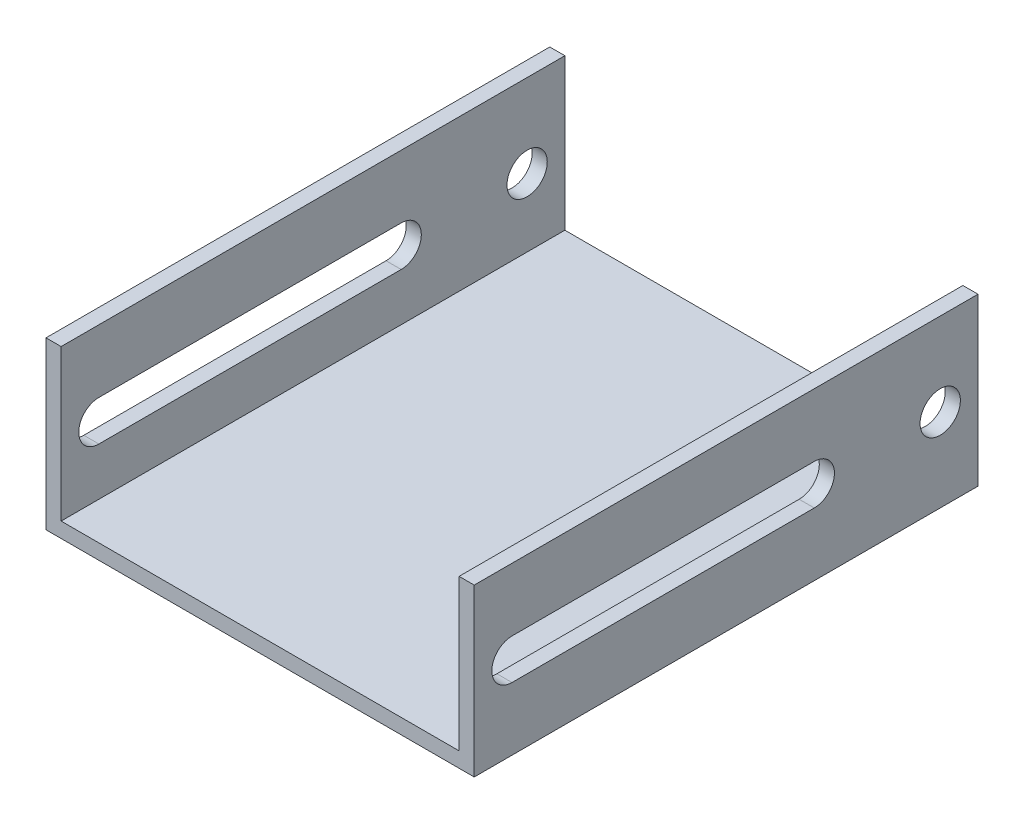
ISO-10303-21;
HEADER;
FILE_DESCRIPTION(('STEP AP214'),'2;1');
FILE_NAME('part.step','',(''),(''),'','','');
FILE_SCHEMA(('AUTOMOTIVE_DESIGN { 1 0 10303 214 1 1 1 1 }'));
ENDSEC;
DATA;
#1=APPLICATION_CONTEXT('core data for automotive mechanical design processes');
#2=APPLICATION_PROTOCOL_DEFINITION('international standard','automotive_design',2000,#1);
#3=PRODUCT_CONTEXT('',#1,'mechanical');
#4=PRODUCT('Part','Part','',(#3));
#5=PRODUCT_RELATED_PRODUCT_CATEGORY('part','',(#4));
#6=PRODUCT_DEFINITION_FORMATION('','',#4);
#7=PRODUCT_DEFINITION_CONTEXT('part definition',#1,'design');
#8=PRODUCT_DEFINITION('design','',#6,#7);
#9=PRODUCT_DEFINITION_SHAPE('','',#8);
#10=(LENGTH_UNIT() NAMED_UNIT(*) SI_UNIT(.MILLI.,.METRE.));
#11=(NAMED_UNIT(*) PLANE_ANGLE_UNIT() SI_UNIT($,.RADIAN.));
#12=(NAMED_UNIT(*) SI_UNIT($,.STERADIAN.) SOLID_ANGLE_UNIT());
#13=UNCERTAINTY_MEASURE_WITH_UNIT(LENGTH_MEASURE(1.E-05),#10,'distance_accuracy_value','');
#14=(GEOMETRIC_REPRESENTATION_CONTEXT(3) GLOBAL_UNCERTAINTY_ASSIGNED_CONTEXT((#13)) GLOBAL_UNIT_ASSIGNED_CONTEXT((#10,
#11,#12)) REPRESENTATION_CONTEXT('',''));
#15=CARTESIAN_POINT('',(0.,0.,0.));
#16=DIRECTION('',(0.,0.,1.));
#17=DIRECTION('',(1.,0.,0.));
#18=AXIS2_PLACEMENT_3D('',#15,#16,#17);
#19=CARTESIAN_POINT('',(0.,3.,0.));
#20=DIRECTION('',(0.,-1.,0.));
#21=DIRECTION('',(0.,0.,-1.));
#22=AXIS2_PLACEMENT_3D('',#19,#20,#21);
#23=PLANE('',#22);
#24=DIRECTION('',(0.,0.,1.));
#25=VECTOR('',#24,1.);
#26=CARTESIAN_POINT('',(39.5,3.,50.));
#27=LINE('',#26,#25);
#28=CARTESIAN_POINT('',(39.5,3.,-50.));
#29=VERTEX_POINT('',#28);
#30=CARTESIAN_POINT('',(39.5,3.,50.));
#31=VERTEX_POINT('',#30);
#32=EDGE_CURVE('E210',#29,#31,#27,.T.);
#33=ORIENTED_EDGE('',*,*,#32,.F.);
#34=DIRECTION('',(-1.,0.,0.));
#35=VECTOR('',#34,1.);
#36=CARTESIAN_POINT('',(-42.5,3.,-50.));
#37=LINE('',#36,#35);
#38=CARTESIAN_POINT('',(-39.5,3.,-50.));
#39=VERTEX_POINT('',#38);
#40=EDGE_CURVE('E261',#29,#39,#37,.T.);
#41=ORIENTED_EDGE('',*,*,#40,.T.);
#42=DIRECTION('',(0.,0.,-1.));
#43=VECTOR('',#42,1.);
#44=CARTESIAN_POINT('',(-39.5,3.,-50.));
#45=LINE('',#44,#43);
#46=CARTESIAN_POINT('',(-39.5,3.,50.));
#47=VERTEX_POINT('',#46);
#48=EDGE_CURVE('E229',#47,#39,#45,.T.);
#49=ORIENTED_EDGE('',*,*,#48,.F.);
#50=DIRECTION('',(1.,0.,0.));
#51=VECTOR('',#50,1.);
#52=CARTESIAN_POINT('',(-42.5,3.,50.));
#53=LINE('',#52,#51);
#54=EDGE_CURVE('E249',#47,#31,#53,.T.);
#55=ORIENTED_EDGE('',*,*,#54,.T.);
#56=EDGE_LOOP('',(#33,#41,#49,#55));
#57=FACE_BOUND('',#56,.T.);
#58=ADVANCED_FACE('F35',(#57),#23,.F.);
#59=CARTESIAN_POINT('',(42.5,3.,50.));
#60=DIRECTION('',(-1.,0.,0.));
#61=DIRECTION('',(0.,0.,1.));
#62=AXIS2_PLACEMENT_3D('',#59,#60,#61);
#63=PLANE('',#62);
#64=DIRECTION('',(0.,0.,1.));
#65=VECTOR('',#64,1.);
#66=CARTESIAN_POINT('',(42.5,20.5,42.5));
#67=LINE('',#66,#65);
#68=CARTESIAN_POINT('',(42.5,20.5,-17.5));
#69=VERTEX_POINT('',#68);
#70=CARTESIAN_POINT('',(42.5,20.5,42.5));
#71=VERTEX_POINT('',#70);
#72=EDGE_CURVE('E163',#69,#71,#67,.T.);
#73=ORIENTED_EDGE('',*,*,#72,.F.);
#74=CARTESIAN_POINT('',(42.5,16.5,-17.5));
#75=DIRECTION('',(1.,0.,0.));
#76=DIRECTION('',(0.,0.,-1.));
#77=AXIS2_PLACEMENT_3D('',#74,#75,#76);
#78=CIRCLE('',#77,4.);
#79=CARTESIAN_POINT('',(42.5,12.5,-17.5));
#80=VERTEX_POINT('',#79);
#81=EDGE_CURVE('E50',#80,#69,#78,.T.);
#82=ORIENTED_EDGE('',*,*,#81,.F.);
#83=DIRECTION('',(0.,0.,-1.));
#84=VECTOR('',#83,1.);
#85=CARTESIAN_POINT('',(42.5,12.5,42.5));
#86=LINE('',#85,#84);
#87=CARTESIAN_POINT('',(42.5,12.5,42.5));
#88=VERTEX_POINT('',#87);
#89=EDGE_CURVE('E170',#88,#80,#86,.T.);
#90=ORIENTED_EDGE('',*,*,#89,.F.);
#91=CARTESIAN_POINT('',(42.5,16.5,42.5));
#92=DIRECTION('',(1.,0.,0.));
#93=DIRECTION('',(0.,0.,-1.));
#94=AXIS2_PLACEMENT_3D('',#91,#92,#93);
#95=CIRCLE('',#94,4.00000000000001);
#96=EDGE_CURVE('E154',#71,#88,#95,.T.);
#97=ORIENTED_EDGE('',*,*,#96,.F.);
#98=EDGE_LOOP('',(#73,#82,#90,#97));
#99=FACE_BOUND('',#98,.T.);
#100=CARTESIAN_POINT('',(42.5,16.5,-42.5));
#101=DIRECTION('',(1.,0.,0.));
#102=DIRECTION('',(0.,0.,-1.));
#103=AXIS2_PLACEMENT_3D('',#100,#101,#102);
#104=CIRCLE('',#103,4.00000000000001);
#105=CARTESIAN_POINT('',(42.5,16.5,-46.5));
#106=VERTEX_POINT('',#105);
#107=EDGE_CURVE('E200',#106,#106,#104,.T.);
#108=ORIENTED_EDGE('',*,*,#107,.F.);
#109=EDGE_LOOP('',(#108));
#110=FACE_BOUND('',#109,.T.);
#111=DIRECTION('',(0.,0.,-1.));
#112=VECTOR('',#111,1.);
#113=CARTESIAN_POINT('',(42.5,0.,50.));
#114=LINE('',#113,#112);
#115=CARTESIAN_POINT('',(42.5,0.,50.));
#116=VERTEX_POINT('',#115);
#117=CARTESIAN_POINT('',(42.5,0.,-50.));
#118=VERTEX_POINT('',#117);
#119=EDGE_CURVE('E258',#116,#118,#114,.T.);
#120=ORIENTED_EDGE('',*,*,#119,.T.);
#121=DIRECTION('',(0.,-1.,0.));
#122=VECTOR('',#121,1.);
#123=CARTESIAN_POINT('',(42.5,3.,-50.));
#124=LINE('',#123,#122);
#125=CARTESIAN_POINT('',(42.5,33.,-50.));
#126=VERTEX_POINT('',#125);
#127=EDGE_CURVE('E268',#126,#118,#124,.T.);
#128=ORIENTED_EDGE('',*,*,#127,.F.);
#129=DIRECTION('',(0.,0.,-1.));
#130=VECTOR('',#129,1.);
#131=CARTESIAN_POINT('',(42.5,33.,50.));
#132=LINE('',#131,#130);
#133=CARTESIAN_POINT('',(42.5,33.,50.));
#134=VERTEX_POINT('',#133);
#135=EDGE_CURVE('E211',#134,#126,#132,.T.);
#136=ORIENTED_EDGE('',*,*,#135,.F.);
#137=DIRECTION('',(0.,-1.,0.));
#138=VECTOR('',#137,1.);
#139=CARTESIAN_POINT('',(42.5,3.,50.));
#140=LINE('',#139,#138);
#141=EDGE_CURVE('E336',#134,#116,#140,.T.);
#142=ORIENTED_EDGE('',*,*,#141,.T.);
#143=EDGE_LOOP('',(#120,#128,#136,#142));
#144=FACE_BOUND('',#143,.T.);
#145=ADVANCED_FACE('F37',(#99,#110,#144),#63,.F.);
#146=CARTESIAN_POINT('',(-42.5,3.,-50.));
#147=DIRECTION('',(0.,0.,1.));
#148=DIRECTION('',(1.,0.,0.));
#149=AXIS2_PLACEMENT_3D('',#146,#147,#148);
#150=PLANE('',#149);
#151=DIRECTION('',(-1.,0.,0.));
#152=VECTOR('',#151,1.);
#153=CARTESIAN_POINT('',(-42.5,0.,-50.));
#154=LINE('',#153,#152);
#155=CARTESIAN_POINT('',(-42.5,0.,-50.));
#156=VERTEX_POINT('',#155);
#157=EDGE_CURVE('E316',#118,#156,#154,.T.);
#158=ORIENTED_EDGE('',*,*,#157,.T.);
#159=DIRECTION('',(0.,-1.,0.));
#160=VECTOR('',#159,1.);
#161=CARTESIAN_POINT('',(-42.5,3.,-50.));
#162=LINE('',#161,#160);
#163=CARTESIAN_POINT('',(-42.5,33.,-50.));
#164=VERTEX_POINT('',#163);
#165=EDGE_CURVE('E319',#164,#156,#162,.T.);
#166=ORIENTED_EDGE('',*,*,#165,.F.);
#167=DIRECTION('',(-1.,0.,0.));
#168=VECTOR('',#167,1.);
#169=CARTESIAN_POINT('',(-42.5,33.,-50.));
#170=LINE('',#169,#168);
#171=CARTESIAN_POINT('',(-39.5,33.,-50.));
#172=VERTEX_POINT('',#171);
#173=EDGE_CURVE('E237',#172,#164,#170,.T.);
#174=ORIENTED_EDGE('',*,*,#173,.F.);
#175=DIRECTION('',(0.,-1.,0.));
#176=VECTOR('',#175,1.);
#177=CARTESIAN_POINT('',(-39.5,33.,-50.));
#178=LINE('',#177,#176);
#179=EDGE_CURVE('E240',#172,#39,#178,.T.);
#180=ORIENTED_EDGE('',*,*,#179,.T.);
#181=ORIENTED_EDGE('',*,*,#40,.F.);
#182=DIRECTION('',(0.,-1.,0.));
#183=VECTOR('',#182,1.);
#184=CARTESIAN_POINT('',(39.5,33.,-50.));
#185=LINE('',#184,#183);
#186=CARTESIAN_POINT('',(39.5,33.,-50.));
#187=VERTEX_POINT('',#186);
#188=EDGE_CURVE('E226',#187,#29,#185,.T.);
#189=ORIENTED_EDGE('',*,*,#188,.F.);
#190=DIRECTION('',(-1.,0.,0.));
#191=VECTOR('',#190,1.);
#192=CARTESIAN_POINT('',(42.5,33.,-50.));
#193=LINE('',#192,#191);
#194=EDGE_CURVE('E214',#126,#187,#193,.T.);
#195=ORIENTED_EDGE('',*,*,#194,.F.);
#196=ORIENTED_EDGE('',*,*,#127,.T.);
#197=EDGE_LOOP('',(#158,#166,#174,#180,#181,#189,#195,#196));
#198=FACE_BOUND('',#197,.T.);
#199=ADVANCED_FACE('F295',(#198),#150,.F.);
#200=CARTESIAN_POINT('',(-42.5,3.,50.));
#201=DIRECTION('',(1.,0.,0.));
#202=DIRECTION('',(0.,0.,-1.));
#203=AXIS2_PLACEMENT_3D('',#200,#201,#202);
#204=PLANE('',#203);
#205=DIRECTION('',(0.,0.,1.));
#206=VECTOR('',#205,1.);
#207=CARTESIAN_POINT('',(-42.5,12.5,42.5));
#208=LINE('',#207,#206);
#209=CARTESIAN_POINT('',(-42.5,12.5,-17.5));
#210=VERTEX_POINT('',#209);
#211=CARTESIAN_POINT('',(-42.5,12.5,42.5));
#212=VERTEX_POINT('',#211);
#213=EDGE_CURVE('E405',#210,#212,#208,.T.);
#214=ORIENTED_EDGE('',*,*,#213,.F.);
#215=CARTESIAN_POINT('',(-42.5,16.5,-17.5));
#216=DIRECTION('',(1.,0.,0.));
#217=DIRECTION('',(0.,0.,-1.));
#218=AXIS2_PLACEMENT_3D('',#215,#216,#217);
#219=CIRCLE('',#218,4.);
#220=CARTESIAN_POINT('',(-42.5,20.5,-17.5));
#221=VERTEX_POINT('',#220);
#222=EDGE_CURVE('E188',#221,#210,#219,.F.);
#223=ORIENTED_EDGE('',*,*,#222,.F.);
#224=DIRECTION('',(0.,0.,-1.));
#225=VECTOR('',#224,1.);
#226=CARTESIAN_POINT('',(-42.5,20.5,42.5));
#227=LINE('',#226,#225);
#228=CARTESIAN_POINT('',(-42.5,20.5,42.5));
#229=VERTEX_POINT('',#228);
#230=EDGE_CURVE('E185',#229,#221,#227,.T.);
#231=ORIENTED_EDGE('',*,*,#230,.F.);
#232=CARTESIAN_POINT('',(-42.5,16.5,42.5));
#233=DIRECTION('',(1.,0.,0.));
#234=DIRECTION('',(0.,0.,-1.));
#235=AXIS2_PLACEMENT_3D('',#232,#233,#234);
#236=CIRCLE('',#235,4.00000000000001);
#237=EDGE_CURVE('E178',#212,#229,#236,.F.);
#238=ORIENTED_EDGE('',*,*,#237,.F.);
#239=EDGE_LOOP('',(#214,#223,#231,#238));
#240=FACE_BOUND('',#239,.T.);
#241=CARTESIAN_POINT('',(-42.5,16.5,-42.5));
#242=DIRECTION('',(1.,0.,0.));
#243=DIRECTION('',(0.,0.,-1.));
#244=AXIS2_PLACEMENT_3D('',#241,#242,#243);
#245=CIRCLE('',#244,4.00000000000001);
#246=CARTESIAN_POINT('',(-42.5,16.5,-46.5));
#247=VERTEX_POINT('',#246);
#248=EDGE_CURVE('E203',#247,#247,#245,.F.);
#249=ORIENTED_EDGE('',*,*,#248,.F.);
#250=EDGE_LOOP('',(#249));
#251=FACE_BOUND('',#250,.T.);
#252=DIRECTION('',(0.,0.,1.));
#253=VECTOR('',#252,1.);
#254=CARTESIAN_POINT('',(-42.5,0.,50.));
#255=LINE('',#254,#253);
#256=CARTESIAN_POINT('',(-42.5,0.,50.));
#257=VERTEX_POINT('',#256);
#258=EDGE_CURVE('E324',#156,#257,#255,.T.);
#259=ORIENTED_EDGE('',*,*,#258,.T.);
#260=DIRECTION('',(0.,-1.,0.));
#261=VECTOR('',#260,1.);
#262=CARTESIAN_POINT('',(-42.5,3.,50.));
#263=LINE('',#262,#261);
#264=CARTESIAN_POINT('',(-42.5,33.,50.));
#265=VERTEX_POINT('',#264);
#266=EDGE_CURVE('E329',#265,#257,#263,.T.);
#267=ORIENTED_EDGE('',*,*,#266,.F.);
#268=DIRECTION('',(0.,0.,1.));
#269=VECTOR('',#268,1.);
#270=CARTESIAN_POINT('',(-42.5,33.,-50.));
#271=LINE('',#270,#269);
#272=EDGE_CURVE('E230',#164,#265,#271,.T.);
#273=ORIENTED_EDGE('',*,*,#272,.F.);
#274=ORIENTED_EDGE('',*,*,#165,.T.);
#275=EDGE_LOOP('',(#259,#267,#273,#274));
#276=FACE_BOUND('',#275,.T.);
#277=ADVANCED_FACE('F307',(#240,#251,#276),#204,.F.);
#278=CARTESIAN_POINT('',(-42.5,3.,50.));
#279=DIRECTION('',(0.,0.,-1.));
#280=DIRECTION('',(-1.,0.,0.));
#281=AXIS2_PLACEMENT_3D('',#278,#279,#280);
#282=PLANE('',#281);
#283=DIRECTION('',(1.,0.,0.));
#284=VECTOR('',#283,1.);
#285=CARTESIAN_POINT('',(-42.5,0.,50.));
#286=LINE('',#285,#284);
#287=EDGE_CURVE('E263',#257,#116,#286,.T.);
#288=ORIENTED_EDGE('',*,*,#287,.T.);
#289=ORIENTED_EDGE('',*,*,#141,.F.);
#290=DIRECTION('',(1.,0.,0.));
#291=VECTOR('',#290,1.);
#292=CARTESIAN_POINT('',(42.5,33.,50.));
#293=LINE('',#292,#291);
#294=CARTESIAN_POINT('',(39.5,33.,50.));
#295=VERTEX_POINT('',#294);
#296=EDGE_CURVE('E218',#295,#134,#293,.T.);
#297=ORIENTED_EDGE('',*,*,#296,.F.);
#298=DIRECTION('',(0.,-1.,0.));
#299=VECTOR('',#298,1.);
#300=CARTESIAN_POINT('',(39.5,33.,50.));
#301=LINE('',#300,#299);
#302=EDGE_CURVE('E221',#295,#31,#301,.T.);
#303=ORIENTED_EDGE('',*,*,#302,.T.);
#304=ORIENTED_EDGE('',*,*,#54,.F.);
#305=DIRECTION('',(0.,-1.,0.));
#306=VECTOR('',#305,1.);
#307=CARTESIAN_POINT('',(-39.5,33.,50.));
#308=LINE('',#307,#306);
#309=CARTESIAN_POINT('',(-39.5,33.,50.));
#310=VERTEX_POINT('',#309);
#311=EDGE_CURVE('E253',#310,#47,#308,.T.);
#312=ORIENTED_EDGE('',*,*,#311,.F.);
#313=DIRECTION('',(1.,0.,0.));
#314=VECTOR('',#313,1.);
#315=CARTESIAN_POINT('',(-42.5,33.,50.));
#316=LINE('',#315,#314);
#317=EDGE_CURVE('E233',#265,#310,#316,.T.);
#318=ORIENTED_EDGE('',*,*,#317,.F.);
#319=ORIENTED_EDGE('',*,*,#266,.T.);
#320=EDGE_LOOP('',(#288,#289,#297,#303,#304,#312,#318,#319));
#321=FACE_BOUND('',#320,.T.);
#322=ADVANCED_FACE('F303',(#321),#282,.F.);
#323=CARTESIAN_POINT('',(0.,0.,0.));
#324=DIRECTION('',(0.,-1.,0.));
#325=DIRECTION('',(0.,0.,-1.));
#326=AXIS2_PLACEMENT_3D('',#323,#324,#325);
#327=PLANE('',#326);
#328=ORIENTED_EDGE('',*,*,#119,.F.);
#329=ORIENTED_EDGE('',*,*,#287,.F.);
#330=ORIENTED_EDGE('',*,*,#258,.F.);
#331=ORIENTED_EDGE('',*,*,#157,.F.);
#332=EDGE_LOOP('',(#328,#329,#330,#331));
#333=FACE_BOUND('',#332,.T.);
#334=ADVANCED_FACE('F300',(#333),#327,.T.);
#335=CARTESIAN_POINT('',(-39.5,33.,-50.));
#336=DIRECTION('',(-1.,0.,0.));
#337=DIRECTION('',(0.,0.,1.));
#338=AXIS2_PLACEMENT_3D('',#335,#336,#337);
#339=PLANE('',#338);
#340=DIRECTION('',(0.,0.,-1.));
#341=VECTOR('',#340,1.);
#342=CARTESIAN_POINT('',(-39.5,20.5,-50.));
#343=LINE('',#342,#341);
#344=CARTESIAN_POINT('',(-39.5,20.5,42.5));
#345=VERTEX_POINT('',#344);
#346=CARTESIAN_POINT('',(-39.5,20.5,-17.5));
#347=VERTEX_POINT('',#346);
#348=EDGE_CURVE('E187',#345,#347,#343,.T.);
#349=ORIENTED_EDGE('',*,*,#348,.T.);
#350=CARTESIAN_POINT('',(-39.5,16.5,-17.5));
#351=DIRECTION('',(-1.,0.,0.));
#352=DIRECTION('',(0.,0.,1.));
#353=AXIS2_PLACEMENT_3D('',#350,#351,#352);
#354=CIRCLE('',#353,4.);
#355=CARTESIAN_POINT('',(-39.5,12.5,-17.5));
#356=VERTEX_POINT('',#355);
#357=EDGE_CURVE('E197',#347,#356,#354,.T.);
#358=ORIENTED_EDGE('',*,*,#357,.T.);
#359=DIRECTION('',(0.,0.,1.));
#360=VECTOR('',#359,1.);
#361=CARTESIAN_POINT('',(-39.5,12.5,-50.));
#362=LINE('',#361,#360);
#363=CARTESIAN_POINT('',(-39.5,12.5,42.5));
#364=VERTEX_POINT('',#363);
#365=EDGE_CURVE('E194',#356,#364,#362,.T.);
#366=ORIENTED_EDGE('',*,*,#365,.T.);
#367=CARTESIAN_POINT('',(-39.5,16.5,42.5));
#368=DIRECTION('',(-1.,0.,0.));
#369=DIRECTION('',(0.,0.,1.));
#370=AXIS2_PLACEMENT_3D('',#367,#368,#369);
#371=CIRCLE('',#370,4.00000000000001);
#372=EDGE_CURVE('E191',#364,#345,#371,.T.);
#373=ORIENTED_EDGE('',*,*,#372,.T.);
#374=EDGE_LOOP('',(#349,#358,#366,#373));
#375=FACE_BOUND('',#374,.T.);
#376=CARTESIAN_POINT('',(-39.5,16.5,-42.5));
#377=DIRECTION('',(-1.,0.,0.));
#378=DIRECTION('',(0.,0.,1.));
#379=AXIS2_PLACEMENT_3D('',#376,#377,#378);
#380=CIRCLE('',#379,4.00000000000001);
#381=CARTESIAN_POINT('',(-39.5,16.5,-38.5));
#382=VERTEX_POINT('',#381);
#383=EDGE_CURVE('E207',#382,#382,#380,.T.);
#384=ORIENTED_EDGE('',*,*,#383,.T.);
#385=EDGE_LOOP('',(#384));
#386=FACE_BOUND('',#385,.T.);
#387=ORIENTED_EDGE('',*,*,#48,.T.);
#388=ORIENTED_EDGE('',*,*,#179,.F.);
#389=DIRECTION('',(0.,0.,-1.));
#390=VECTOR('',#389,1.);
#391=CARTESIAN_POINT('',(-39.5,33.,-50.));
#392=LINE('',#391,#390);
#393=EDGE_CURVE('E235',#310,#172,#392,.T.);
#394=ORIENTED_EDGE('',*,*,#393,.F.);
#395=ORIENTED_EDGE('',*,*,#311,.T.);
#396=EDGE_LOOP('',(#387,#388,#394,#395));
#397=FACE_BOUND('',#396,.T.);
#398=ADVANCED_FACE('F298',(#375,#386,#397),#339,.F.);
#399=CARTESIAN_POINT('',(0.,33.,0.));
#400=DIRECTION('',(0.,1.,0.));
#401=DIRECTION('',(0.,0.,1.));
#402=AXIS2_PLACEMENT_3D('',#399,#400,#401);
#403=PLANE('',#402);
#404=ORIENTED_EDGE('',*,*,#272,.T.);
#405=ORIENTED_EDGE('',*,*,#317,.T.);
#406=ORIENTED_EDGE('',*,*,#393,.T.);
#407=ORIENTED_EDGE('',*,*,#173,.T.);
#408=EDGE_LOOP('',(#404,#405,#406,#407));
#409=FACE_BOUND('',#408,.T.);
#410=ADVANCED_FACE('F344',(#409),#403,.T.);
#411=CARTESIAN_POINT('',(39.5,33.,50.));
#412=DIRECTION('',(1.,0.,0.));
#413=DIRECTION('',(0.,0.,-1.));
#414=AXIS2_PLACEMENT_3D('',#411,#412,#413);
#415=PLANE('',#414);
#416=DIRECTION('',(0.,0.,-1.));
#417=VECTOR('',#416,1.);
#418=CARTESIAN_POINT('',(39.5,12.5,50.));
#419=LINE('',#418,#417);
#420=CARTESIAN_POINT('',(39.5,12.5,42.5));
#421=VERTEX_POINT('',#420);
#422=CARTESIAN_POINT('',(39.5,12.5,-17.5));
#423=VERTEX_POINT('',#422);
#424=EDGE_CURVE('E43',#421,#423,#419,.T.);
#425=ORIENTED_EDGE('',*,*,#424,.T.);
#426=CARTESIAN_POINT('',(39.5,16.5,-17.5));
#427=DIRECTION('',(1.,0.,0.));
#428=DIRECTION('',(0.,0.,-1.));
#429=AXIS2_PLACEMENT_3D('',#426,#427,#428);
#430=CIRCLE('',#429,4.);
#431=CARTESIAN_POINT('',(39.5,20.5,-17.5));
#432=VERTEX_POINT('',#431);
#433=EDGE_CURVE('E11',#423,#432,#430,.T.);
#434=ORIENTED_EDGE('',*,*,#433,.T.);
#435=DIRECTION('',(0.,0.,1.));
#436=VECTOR('',#435,1.);
#437=CARTESIAN_POINT('',(39.5,20.5,50.));
#438=LINE('',#437,#436);
#439=CARTESIAN_POINT('',(39.5,20.5,42.5));
#440=VERTEX_POINT('',#439);
#441=EDGE_CURVE('E266',#432,#440,#438,.T.);
#442=ORIENTED_EDGE('',*,*,#441,.T.);
#443=CARTESIAN_POINT('',(39.5,16.5,42.5));
#444=DIRECTION('',(1.,0.,0.));
#445=DIRECTION('',(0.,0.,-1.));
#446=AXIS2_PLACEMENT_3D('',#443,#444,#445);
#447=CIRCLE('',#446,4.00000000000001);
#448=EDGE_CURVE('E157',#440,#421,#447,.T.);
#449=ORIENTED_EDGE('',*,*,#448,.T.);
#450=EDGE_LOOP('',(#425,#434,#442,#449));
#451=FACE_BOUND('',#450,.T.);
#452=CARTESIAN_POINT('',(39.5,16.5,-42.5));
#453=DIRECTION('',(1.,0.,0.));
#454=DIRECTION('',(0.,0.,-1.));
#455=AXIS2_PLACEMENT_3D('',#452,#453,#454);
#456=CIRCLE('',#455,4.00000000000001);
#457=CARTESIAN_POINT('',(39.5,16.5,-46.5));
#458=VERTEX_POINT('',#457);
#459=EDGE_CURVE('E206',#458,#458,#456,.T.);
#460=ORIENTED_EDGE('',*,*,#459,.T.);
#461=EDGE_LOOP('',(#460));
#462=FACE_BOUND('',#461,.T.);
#463=ORIENTED_EDGE('',*,*,#32,.T.);
#464=ORIENTED_EDGE('',*,*,#302,.F.);
#465=DIRECTION('',(0.,0.,1.));
#466=VECTOR('',#465,1.);
#467=CARTESIAN_POINT('',(39.5,33.,50.));
#468=LINE('',#467,#466);
#469=EDGE_CURVE('E216',#187,#295,#468,.T.);
#470=ORIENTED_EDGE('',*,*,#469,.F.);
#471=ORIENTED_EDGE('',*,*,#188,.T.);
#472=EDGE_LOOP('',(#463,#464,#470,#471));
#473=FACE_BOUND('',#472,.T.);
#474=ADVANCED_FACE('F271',(#451,#462,#473),#415,.F.);
#475=CARTESIAN_POINT('',(0.,33.,0.));
#476=DIRECTION('',(0.,1.,0.));
#477=DIRECTION('',(0.,0.,1.));
#478=AXIS2_PLACEMENT_3D('',#475,#476,#477);
#479=PLANE('',#478);
#480=ORIENTED_EDGE('',*,*,#135,.T.);
#481=ORIENTED_EDGE('',*,*,#194,.T.);
#482=ORIENTED_EDGE('',*,*,#469,.T.);
#483=ORIENTED_EDGE('',*,*,#296,.T.);
#484=EDGE_LOOP('',(#480,#481,#482,#483));
#485=FACE_BOUND('',#484,.T.);
#486=ADVANCED_FACE('F355',(#485),#479,.T.);
#487=CARTESIAN_POINT('',(-110.968971074495,16.5,-42.5));
#488=DIRECTION('',(1.,0.,0.));
#489=DIRECTION('',(0.,0.,-1.));
#490=AXIS2_PLACEMENT_3D('',#487,#488,#489);
#491=CYLINDRICAL_SURFACE('',#490,4.00000000000001);
#492=ORIENTED_EDGE('',*,*,#107,.T.);
#493=EDGE_LOOP('',(#492));
#494=FACE_BOUND('',#493,.T.);
#495=ORIENTED_EDGE('',*,*,#459,.F.);
#496=EDGE_LOOP('',(#495));
#497=FACE_BOUND('',#496,.T.);
#498=ADVANCED_FACE('F359',(#494,#497),#491,.F.);
#499=ORIENTED_EDGE('',*,*,#248,.T.);
#500=EDGE_LOOP('',(#499));
#501=FACE_BOUND('',#500,.T.);
#502=ORIENTED_EDGE('',*,*,#383,.F.);
#503=EDGE_LOOP('',(#502));
#504=FACE_BOUND('',#503,.T.);
#505=ADVANCED_FACE('F365',(#501,#504),#491,.F.);
#506=CARTESIAN_POINT('',(-110.968971074495,20.5,42.5));
#507=DIRECTION('',(0.,1.,0.));
#508=DIRECTION('',(0.,0.,1.));
#509=AXIS2_PLACEMENT_3D('',#506,#507,#508);
#510=PLANE('',#509);
#511=DIRECTION('',(1.,0.,0.));
#512=VECTOR('',#511,1.);
#513=CARTESIAN_POINT('',(-110.968971074495,20.5,-17.5));
#514=LINE('',#513,#512);
#515=EDGE_CURVE('E165',#432,#69,#514,.T.);
#516=ORIENTED_EDGE('',*,*,#515,.T.);
#517=ORIENTED_EDGE('',*,*,#72,.T.);
#518=DIRECTION('',(1.,0.,0.));
#519=VECTOR('',#518,1.);
#520=CARTESIAN_POINT('',(-110.968971074495,20.5,42.5));
#521=LINE('',#520,#519);
#522=EDGE_CURVE('E149',#440,#71,#521,.T.);
#523=ORIENTED_EDGE('',*,*,#522,.F.);
#524=ORIENTED_EDGE('',*,*,#441,.F.);
#525=EDGE_LOOP('',(#516,#517,#523,#524));
#526=FACE_BOUND('',#525,.T.);
#527=ADVANCED_FACE('F164',(#526),#510,.F.);
#528=CARTESIAN_POINT('',(-110.968971074495,16.5,42.5));
#529=DIRECTION('',(1.,0.,0.));
#530=DIRECTION('',(0.,0.,-1.));
#531=AXIS2_PLACEMENT_3D('',#528,#529,#530);
#532=CYLINDRICAL_SURFACE('',#531,4.00000000000001);
#533=ORIENTED_EDGE('',*,*,#522,.T.);
#534=ORIENTED_EDGE('',*,*,#96,.T.);
#535=DIRECTION('',(1.,0.,0.));
#536=VECTOR('',#535,1.);
#537=CARTESIAN_POINT('',(-110.968971074495,12.5,42.5));
#538=LINE('',#537,#536);
#539=EDGE_CURVE('E182',#421,#88,#538,.T.);
#540=ORIENTED_EDGE('',*,*,#539,.F.);
#541=ORIENTED_EDGE('',*,*,#448,.F.);
#542=EDGE_LOOP('',(#533,#534,#540,#541));
#543=FACE_BOUND('',#542,.T.);
#544=ADVANCED_FACE('F151',(#543),#532,.F.);
#545=CARTESIAN_POINT('',(-110.968971074495,12.5,42.5));
#546=DIRECTION('',(0.,-1.,0.));
#547=DIRECTION('',(0.,0.,-1.));
#548=AXIS2_PLACEMENT_3D('',#545,#546,#547);
#549=PLANE('',#548);
#550=ORIENTED_EDGE('',*,*,#539,.T.);
#551=ORIENTED_EDGE('',*,*,#89,.T.);
#552=DIRECTION('',(1.,0.,0.));
#553=VECTOR('',#552,1.);
#554=CARTESIAN_POINT('',(-110.968971074495,12.5,-17.5));
#555=LINE('',#554,#553);
#556=EDGE_CURVE('E179',#423,#80,#555,.T.);
#557=ORIENTED_EDGE('',*,*,#556,.F.);
#558=ORIENTED_EDGE('',*,*,#424,.F.);
#559=EDGE_LOOP('',(#550,#551,#557,#558));
#560=FACE_BOUND('',#559,.T.);
#561=ADVANCED_FACE('F275',(#560),#549,.F.);
#562=CARTESIAN_POINT('',(-110.968971074495,16.5,-17.5));
#563=DIRECTION('',(1.,0.,0.));
#564=DIRECTION('',(0.,0.,-1.));
#565=AXIS2_PLACEMENT_3D('',#562,#563,#564);
#566=CYLINDRICAL_SURFACE('',#565,4.);
#567=ORIENTED_EDGE('',*,*,#556,.T.);
#568=ORIENTED_EDGE('',*,*,#81,.T.);
#569=ORIENTED_EDGE('',*,*,#515,.F.);
#570=ORIENTED_EDGE('',*,*,#433,.F.);
#571=EDGE_LOOP('',(#567,#568,#569,#570));
#572=FACE_BOUND('',#571,.T.);
#573=ADVANCED_FACE('F276',(#572),#566,.F.);
#574=EDGE_CURVE('E160',#221,#347,#514,.T.);
#575=ORIENTED_EDGE('',*,*,#574,.F.);
#576=ORIENTED_EDGE('',*,*,#222,.T.);
#577=EDGE_CURVE('E175',#210,#356,#555,.T.);
#578=ORIENTED_EDGE('',*,*,#577,.T.);
#579=ORIENTED_EDGE('',*,*,#357,.F.);
#580=EDGE_LOOP('',(#575,#576,#578,#579));
#581=FACE_BOUND('',#580,.T.);
#582=ADVANCED_FACE('F278',(#581),#566,.F.);
#583=ORIENTED_EDGE('',*,*,#577,.F.);
#584=ORIENTED_EDGE('',*,*,#213,.T.);
#585=EDGE_CURVE('E180',#212,#364,#538,.T.);
#586=ORIENTED_EDGE('',*,*,#585,.T.);
#587=ORIENTED_EDGE('',*,*,#365,.F.);
#588=EDGE_LOOP('',(#583,#584,#586,#587));
#589=FACE_BOUND('',#588,.T.);
#590=ADVANCED_FACE('F284',(#589),#549,.F.);
#591=ORIENTED_EDGE('',*,*,#585,.F.);
#592=ORIENTED_EDGE('',*,*,#237,.T.);
#593=EDGE_CURVE('E58',#229,#345,#521,.T.);
#594=ORIENTED_EDGE('',*,*,#593,.T.);
#595=ORIENTED_EDGE('',*,*,#372,.F.);
#596=EDGE_LOOP('',(#591,#592,#594,#595));
#597=FACE_BOUND('',#596,.T.);
#598=ADVANCED_FACE('F390',(#597),#532,.F.);
#599=ORIENTED_EDGE('',*,*,#593,.F.);
#600=ORIENTED_EDGE('',*,*,#230,.T.);
#601=ORIENTED_EDGE('',*,*,#574,.T.);
#602=ORIENTED_EDGE('',*,*,#348,.F.);
#603=EDGE_LOOP('',(#599,#600,#601,#602));
#604=FACE_BOUND('',#603,.T.);
#605=ADVANCED_FACE('F383',(#604),#510,.F.);
#606=CLOSED_SHELL('',(#58,#145,#199,#277,#322,#334,#398,#410,#474,#486,#498,#505,#527,#544,#561,
#573,#582,#590,#598,#605));
#607=MANIFOLD_SOLID_BREP('B2',#606);
#608=ADVANCED_BREP_SHAPE_REPRESENTATION('',(#18,#607),#14);
#609=SHAPE_DEFINITION_REPRESENTATION(#9,#608);
ENDSEC;
END-ISO-10303-21;
